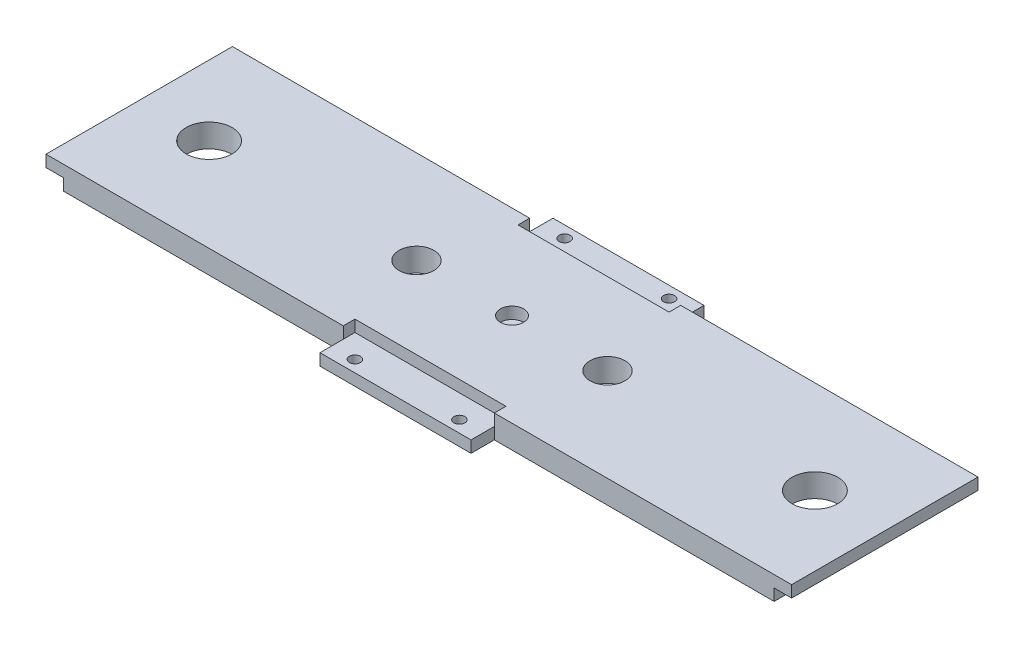
ISO-10303-21;
HEADER;
FILE_DESCRIPTION(('STEP AP214'),'2;1');
FILE_NAME('part.step','',(''),(''),'','','');
FILE_SCHEMA(('AUTOMOTIVE_DESIGN { 1 0 10303 214 1 1 1 1 }'));
ENDSEC;
DATA;
#1=APPLICATION_CONTEXT('core data for automotive mechanical design processes');
#2=APPLICATION_PROTOCOL_DEFINITION('international standard','automotive_design',2000,#1);
#3=PRODUCT_CONTEXT('',#1,'mechanical');
#4=PRODUCT('Part','Part','',(#3));
#5=PRODUCT_RELATED_PRODUCT_CATEGORY('part','',(#4));
#6=PRODUCT_DEFINITION_FORMATION('','',#4);
#7=PRODUCT_DEFINITION_CONTEXT('part definition',#1,'design');
#8=PRODUCT_DEFINITION('design','',#6,#7);
#9=PRODUCT_DEFINITION_SHAPE('','',#8);
#10=(LENGTH_UNIT() NAMED_UNIT(*) SI_UNIT(.MILLI.,.METRE.));
#11=(NAMED_UNIT(*) PLANE_ANGLE_UNIT() SI_UNIT($,.RADIAN.));
#12=(NAMED_UNIT(*) SI_UNIT($,.STERADIAN.) SOLID_ANGLE_UNIT());
#13=UNCERTAINTY_MEASURE_WITH_UNIT(LENGTH_MEASURE(1.E-05),#10,'distance_accuracy_value','');
#14=(GEOMETRIC_REPRESENTATION_CONTEXT(3) GLOBAL_UNCERTAINTY_ASSIGNED_CONTEXT((#13)) GLOBAL_UNIT_ASSIGNED_CONTEXT((#10,
#11,#12)) REPRESENTATION_CONTEXT('',''));
#15=CARTESIAN_POINT('',(0.,0.,0.));
#16=DIRECTION('',(0.,0.,1.));
#17=DIRECTION('',(1.,0.,0.));
#18=AXIS2_PLACEMENT_3D('',#15,#16,#17);
#19=CARTESIAN_POINT('',(-101.6,6.35,-25.4));
#20=DIRECTION('',(0.,0.,1.));
#21=DIRECTION('',(1.,0.,0.));
#22=AXIS2_PLACEMENT_3D('',#19,#20,#21);
#23=PLANE('',#22);
#24=DIRECTION('',(-1.,0.,0.));
#25=VECTOR('',#24,1.);
#26=CARTESIAN_POINT('',(-101.6,0.,-25.4));
#27=LINE('',#26,#25);
#28=CARTESIAN_POINT('',(96.8375,0.,-25.4));
#29=VERTEX_POINT('',#28);
#30=CARTESIAN_POINT('',(20.579999988,0.,-25.4));
#31=VERTEX_POINT('',#30);
#32=EDGE_CURVE('E56',#29,#31,#27,.T.);
#33=ORIENTED_EDGE('',*,*,#32,.T.);
#34=DIRECTION('',(0.,1.,0.));
#35=VECTOR('',#34,1.);
#36=CARTESIAN_POINT('',(20.579999988,6.35,-25.4));
#37=LINE('',#36,#35);
#38=CARTESIAN_POINT('',(20.579999988,3.175,-25.4));
#39=VERTEX_POINT('',#38);
#40=EDGE_CURVE('E198',#31,#39,#37,.T.);
#41=ORIENTED_EDGE('',*,*,#40,.T.);
#42=DIRECTION('',(0.,1.,0.));
#43=VECTOR('',#42,1.);
#44=CARTESIAN_POINT('',(20.579999988,3.175,-25.4));
#45=LINE('',#44,#43);
#46=CARTESIAN_POINT('',(20.579999988,6.35,-25.4));
#47=VERTEX_POINT('',#46);
#48=EDGE_CURVE('E403',#39,#47,#45,.T.);
#49=ORIENTED_EDGE('',*,*,#48,.T.);
#50=DIRECTION('',(-1.,0.,0.));
#51=VECTOR('',#50,1.);
#52=CARTESIAN_POINT('',(-101.6,6.35,-25.4));
#53=LINE('',#52,#51);
#54=CARTESIAN_POINT('',(101.6,6.35,-25.4));
#55=VERTEX_POINT('',#54);
#56=EDGE_CURVE('E437',#55,#47,#53,.T.);
#57=ORIENTED_EDGE('',*,*,#56,.F.);
#58=DIRECTION('',(0.,-1.,0.));
#59=VECTOR('',#58,1.);
#60=CARTESIAN_POINT('',(101.6,6.35,-25.4));
#61=LINE('',#60,#59);
#62=CARTESIAN_POINT('',(101.6,3.175,-25.4));
#63=VERTEX_POINT('',#62);
#64=EDGE_CURVE('E43',#55,#63,#61,.T.);
#65=ORIENTED_EDGE('',*,*,#64,.T.);
#66=DIRECTION('',(1.,0.,0.));
#67=VECTOR('',#66,1.);
#68=CARTESIAN_POINT('',(96.8375,3.175,-25.4));
#69=LINE('',#68,#67);
#70=CARTESIAN_POINT('',(96.8375,3.175,-25.4));
#71=VERTEX_POINT('',#70);
#72=EDGE_CURVE('E319',#71,#63,#69,.T.);
#73=ORIENTED_EDGE('',*,*,#72,.F.);
#74=DIRECTION('',(0.,-1.,0.));
#75=VECTOR('',#74,1.);
#76=CARTESIAN_POINT('',(96.8375,3.175,-25.4));
#77=LINE('',#76,#75);
#78=EDGE_CURVE('E311',#71,#29,#77,.T.);
#79=ORIENTED_EDGE('',*,*,#78,.T.);
#80=EDGE_LOOP('',(#33,#41,#49,#57,#65,#73,#79));
#81=FACE_BOUND('',#80,.T.);
#82=ADVANCED_FACE('F39',(#81),#23,.F.);
#83=CARTESIAN_POINT('',(-101.6,6.35,25.4));
#84=DIRECTION('',(0.,0.,-1.));
#85=DIRECTION('',(-1.,0.,0.));
#86=AXIS2_PLACEMENT_3D('',#83,#84,#85);
#87=PLANE('',#86);
#88=DIRECTION('',(0.,1.,0.));
#89=VECTOR('',#88,1.);
#90=CARTESIAN_POINT('',(20.579999988,3.175,25.4));
#91=LINE('',#90,#89);
#92=CARTESIAN_POINT('',(20.579999988,3.175,25.4));
#93=VERTEX_POINT('',#92);
#94=CARTESIAN_POINT('',(20.579999988,6.35,25.4));
#95=VERTEX_POINT('',#94);
#96=EDGE_CURVE('E353',#93,#95,#91,.T.);
#97=ORIENTED_EDGE('',*,*,#96,.F.);
#98=DIRECTION('',(0.,-1.,0.));
#99=VECTOR('',#98,1.);
#100=CARTESIAN_POINT('',(20.579999988,6.35,25.4));
#101=LINE('',#100,#99);
#102=CARTESIAN_POINT('',(20.579999988,0.,25.4));
#103=VERTEX_POINT('',#102);
#104=EDGE_CURVE('E271',#93,#103,#101,.T.);
#105=ORIENTED_EDGE('',*,*,#104,.T.);
#106=DIRECTION('',(1.,0.,0.));
#107=VECTOR('',#106,1.);
#108=CARTESIAN_POINT('',(-101.6,0.,25.4));
#109=LINE('',#108,#107);
#110=CARTESIAN_POINT('',(96.8375,0.,25.4));
#111=VERTEX_POINT('',#110);
#112=EDGE_CURVE('E452',#103,#111,#109,.T.);
#113=ORIENTED_EDGE('',*,*,#112,.T.);
#114=DIRECTION('',(0.,-1.,0.));
#115=VECTOR('',#114,1.);
#116=CARTESIAN_POINT('',(96.8375,3.175,25.4));
#117=LINE('',#116,#115);
#118=CARTESIAN_POINT('',(96.8375,3.175,25.4));
#119=VERTEX_POINT('',#118);
#120=EDGE_CURVE('E332',#119,#111,#117,.T.);
#121=ORIENTED_EDGE('',*,*,#120,.F.);
#122=DIRECTION('',(-1.,0.,0.));
#123=VECTOR('',#122,1.);
#124=CARTESIAN_POINT('',(101.6,3.175,25.4));
#125=LINE('',#124,#123);
#126=CARTESIAN_POINT('',(101.6,3.175,25.4));
#127=VERTEX_POINT('',#126);
#128=EDGE_CURVE('E325',#127,#119,#125,.T.);
#129=ORIENTED_EDGE('',*,*,#128,.F.);
#130=DIRECTION('',(0.,-1.,0.));
#131=VECTOR('',#130,1.);
#132=CARTESIAN_POINT('',(101.6,6.35,25.4));
#133=LINE('',#132,#131);
#134=CARTESIAN_POINT('',(101.6,6.35,25.4));
#135=VERTEX_POINT('',#134);
#136=EDGE_CURVE('E449',#135,#127,#133,.T.);
#137=ORIENTED_EDGE('',*,*,#136,.F.);
#138=DIRECTION('',(1.,0.,0.));
#139=VECTOR('',#138,1.);
#140=CARTESIAN_POINT('',(-101.6,6.35,25.4));
#141=LINE('',#140,#139);
#142=EDGE_CURVE('E444',#95,#135,#141,.T.);
#143=ORIENTED_EDGE('',*,*,#142,.F.);
#144=EDGE_LOOP('',(#97,#105,#113,#121,#129,#137,#143));
#145=FACE_BOUND('',#144,.T.);
#146=ADVANCED_FACE('F483',(#145),#87,.F.);
#147=CARTESIAN_POINT('',(101.6,6.35,25.4));
#148=DIRECTION('',(-1.,0.,0.));
#149=DIRECTION('',(0.,0.,1.));
#150=AXIS2_PLACEMENT_3D('',#147,#148,#149);
#151=PLANE('',#150);
#152=DIRECTION('',(0.,0.,1.));
#153=VECTOR('',#152,1.);
#154=CARTESIAN_POINT('',(101.6,3.175,-25.4));
#155=LINE('',#154,#153);
#156=EDGE_CURVE('E322',#63,#127,#155,.T.);
#157=ORIENTED_EDGE('',*,*,#156,.F.);
#158=ORIENTED_EDGE('',*,*,#64,.F.);
#159=DIRECTION('',(0.,0.,-1.));
#160=VECTOR('',#159,1.);
#161=CARTESIAN_POINT('',(101.6,6.35,25.4));
#162=LINE('',#161,#160);
#163=EDGE_CURVE('E432',#135,#55,#162,.T.);
#164=ORIENTED_EDGE('',*,*,#163,.F.);
#165=ORIENTED_EDGE('',*,*,#136,.T.);
#166=EDGE_LOOP('',(#157,#158,#164,#165));
#167=FACE_BOUND('',#166,.T.);
#168=ADVANCED_FACE('F41',(#167),#151,.F.);
#169=CARTESIAN_POINT('',(0.,6.35,0.));
#170=DIRECTION('',(0.,-1.,0.));
#171=DIRECTION('',(0.,0.,-1.));
#172=AXIS2_PLACEMENT_3D('',#169,#170,#171);
#173=PLANE('',#172);
#174=CARTESIAN_POINT('',(-26.035,6.35,0.));
#175=DIRECTION('',(0.,1.,0.));
#176=DIRECTION('',(0.,0.,1.));
#177=AXIS2_PLACEMENT_3D('',#174,#175,#176);
#178=CIRCLE('',#177,4.7625);
#179=CARTESIAN_POINT('',(-26.035,6.35,4.7625));
#180=VERTEX_POINT('',#179);
#181=EDGE_CURVE('E283',#180,#180,#178,.T.);
#182=ORIENTED_EDGE('',*,*,#181,.F.);
#183=EDGE_LOOP('',(#182));
#184=FACE_BOUND('',#183,.T.);
#185=CARTESIAN_POINT('',(26.035,6.35,0.));
#186=DIRECTION('',(0.,1.,0.));
#187=DIRECTION('',(0.,0.,-1.));
#188=AXIS2_PLACEMENT_3D('',#185,#186,#187);
#189=CIRCLE('',#188,4.7625);
#190=CARTESIAN_POINT('',(26.035,6.35,-4.76250000000001));
#191=VERTEX_POINT('',#190);
#192=EDGE_CURVE('E276',#191,#191,#189,.T.);
#193=ORIENTED_EDGE('',*,*,#192,.F.);
#194=EDGE_LOOP('',(#193));
#195=FACE_BOUND('',#194,.T.);
#196=CARTESIAN_POINT('',(-101.6,6.35,25.4));
#197=VERTEX_POINT('',#196);
#198=CARTESIAN_POINT('',(-20.579999988,6.35,25.4));
#199=VERTEX_POINT('',#198);
#200=EDGE_CURVE('E445',#197,#199,#141,.T.);
#201=ORIENTED_EDGE('',*,*,#200,.T.);
#202=DIRECTION('',(0.,0.,1.));
#203=VECTOR('',#202,1.);
#204=CARTESIAN_POINT('',(-20.579999988,6.35,22.225));
#205=LINE('',#204,#203);
#206=CARTESIAN_POINT('',(-20.579999988,6.35,22.225));
#207=VERTEX_POINT('',#206);
#208=EDGE_CURVE('E345',#207,#199,#205,.T.);
#209=ORIENTED_EDGE('',*,*,#208,.F.);
#210=DIRECTION('',(-1.,0.,0.));
#211=VECTOR('',#210,1.);
#212=CARTESIAN_POINT('',(20.579999988,6.35,22.225));
#213=LINE('',#212,#211);
#214=CARTESIAN_POINT('',(20.579999988,6.35,22.225));
#215=VERTEX_POINT('',#214);
#216=EDGE_CURVE('E358',#215,#207,#213,.T.);
#217=ORIENTED_EDGE('',*,*,#216,.F.);
#218=DIRECTION('',(0.,0.,-1.));
#219=VECTOR('',#218,1.);
#220=CARTESIAN_POINT('',(20.579999988,6.35,25.4));
#221=LINE('',#220,#219);
#222=EDGE_CURVE('E354',#95,#215,#221,.T.);
#223=ORIENTED_EDGE('',*,*,#222,.F.);
#224=ORIENTED_EDGE('',*,*,#142,.T.);
#225=ORIENTED_EDGE('',*,*,#163,.T.);
#226=ORIENTED_EDGE('',*,*,#56,.T.);
#227=DIRECTION('',(0.,0.,-1.));
#228=VECTOR('',#227,1.);
#229=CARTESIAN_POINT('',(20.579999988,6.35,-25.4));
#230=LINE('',#229,#228);
#231=CARTESIAN_POINT('',(20.579999988,6.35,-22.225));
#232=VERTEX_POINT('',#231);
#233=EDGE_CURVE('E383',#232,#47,#230,.T.);
#234=ORIENTED_EDGE('',*,*,#233,.F.);
#235=DIRECTION('',(1.,0.,0.));
#236=VECTOR('',#235,1.);
#237=CARTESIAN_POINT('',(20.579999988,6.35,-22.225));
#238=LINE('',#237,#236);
#239=CARTESIAN_POINT('',(-20.579999988,6.35,-22.225));
#240=VERTEX_POINT('',#239);
#241=EDGE_CURVE('E395',#240,#232,#238,.T.);
#242=ORIENTED_EDGE('',*,*,#241,.F.);
#243=DIRECTION('',(0.,0.,1.));
#244=VECTOR('',#243,1.);
#245=CARTESIAN_POINT('',(-20.579999988,6.35,-22.225));
#246=LINE('',#245,#244);
#247=CARTESIAN_POINT('',(-20.579999988,6.35,-25.4));
#248=VERTEX_POINT('',#247);
#249=EDGE_CURVE('E315',#248,#240,#246,.T.);
#250=ORIENTED_EDGE('',*,*,#249,.F.);
#251=CARTESIAN_POINT('',(-101.6,6.35,-25.4));
#252=VERTEX_POINT('',#251);
#253=EDGE_CURVE('E436',#248,#252,#53,.T.);
#254=ORIENTED_EDGE('',*,*,#253,.T.);
#255=DIRECTION('',(0.,0.,1.));
#256=VECTOR('',#255,1.);
#257=CARTESIAN_POINT('',(-101.6,6.35,25.4));
#258=LINE('',#257,#256);
#259=EDGE_CURVE('E441',#252,#197,#258,.T.);
#260=ORIENTED_EDGE('',*,*,#259,.T.);
#261=EDGE_LOOP('',(#201,#209,#217,#223,#224,#225,#226,#234,#242,#250,#254,#260));
#262=FACE_BOUND('',#261,.T.);
#263=CARTESIAN_POINT('',(-82.55,6.35,0.));
#264=DIRECTION('',(0.,1.,0.));
#265=DIRECTION('',(0.,0.,1.));
#266=AXIS2_PLACEMENT_3D('',#263,#264,#265);
#267=CIRCLE('',#266,6.25);
#268=CARTESIAN_POINT('',(-82.55,6.35,6.25));
#269=VERTEX_POINT('',#268);
#270=EDGE_CURVE('E424',#269,#269,#267,.T.);
#271=ORIENTED_EDGE('',*,*,#270,.F.);
#272=EDGE_LOOP('',(#271));
#273=FACE_BOUND('',#272,.T.);
#274=CARTESIAN_POINT('',(82.55,6.35,0.));
#275=DIRECTION('',(0.,1.,0.));
#276=DIRECTION('',(0.,0.,-1.));
#277=AXIS2_PLACEMENT_3D('',#274,#275,#276);
#278=CIRCLE('',#277,6.25);
#279=CARTESIAN_POINT('',(82.55,6.35,-6.25));
#280=VERTEX_POINT('',#279);
#281=EDGE_CURVE('E416',#280,#280,#278,.T.);
#282=ORIENTED_EDGE('',*,*,#281,.F.);
#283=EDGE_LOOP('',(#282));
#284=FACE_BOUND('',#283,.T.);
#285=CARTESIAN_POINT('',(0.,6.35,0.));
#286=DIRECTION('',(0.,1.,0.));
#287=DIRECTION('',(0.,0.,1.));
#288=AXIS2_PLACEMENT_3D('',#285,#286,#287);
#289=CIRCLE('',#288,3.175);
#290=CARTESIAN_POINT('',(0.,6.35,3.175));
#291=VERTEX_POINT('',#290);
#292=EDGE_CURVE('E369',#291,#291,#289,.T.);
#293=ORIENTED_EDGE('',*,*,#292,.F.);
#294=EDGE_LOOP('',(#293));
#295=FACE_BOUND('',#294,.T.);
#296=ADVANCED_FACE('F519',(#184,#195,#262,#273,#284,#295),#173,.F.);
#297=CARTESIAN_POINT('',(0.,0.,0.));
#298=DIRECTION('',(0.,-1.,0.));
#299=DIRECTION('',(0.,0.,-1.));
#300=AXIS2_PLACEMENT_3D('',#297,#298,#299);
#301=PLANE('',#300);
#302=CARTESIAN_POINT('',(-14.229999988,0.,28.575));
#303=DIRECTION('',(0.,-1.,0.));
#304=DIRECTION('',(0.,0.,-1.));
#305=AXIS2_PLACEMENT_3D('',#302,#303,#304);
#306=CIRCLE('',#305,1.5);
#307=CARTESIAN_POINT('',(-14.229999988,0.,27.075));
#308=VERTEX_POINT('',#307);
#309=EDGE_CURVE('E221',#308,#308,#306,.T.);
#310=ORIENTED_EDGE('',*,*,#309,.F.);
#311=EDGE_LOOP('',(#310));
#312=FACE_BOUND('',#311,.T.);
#313=CARTESIAN_POINT('',(14.229999988,0.,28.575));
#314=DIRECTION('',(0.,-1.,0.));
#315=DIRECTION('',(0.,0.,-1.));
#316=AXIS2_PLACEMENT_3D('',#313,#314,#315);
#317=CIRCLE('',#316,1.5);
#318=CARTESIAN_POINT('',(14.229999988,0.,27.075));
#319=VERTEX_POINT('',#318);
#320=EDGE_CURVE('E225',#319,#319,#317,.T.);
#321=ORIENTED_EDGE('',*,*,#320,.F.);
#322=EDGE_LOOP('',(#321));
#323=FACE_BOUND('',#322,.T.);
#324=CARTESIAN_POINT('',(14.229999988,0.,-28.575));
#325=DIRECTION('',(0.,-1.,0.));
#326=DIRECTION('',(0.,0.,-1.));
#327=AXIS2_PLACEMENT_3D('',#324,#325,#326);
#328=CIRCLE('',#327,1.5);
#329=CARTESIAN_POINT('',(14.229999988,0.,-30.075));
#330=VERTEX_POINT('',#329);
#331=EDGE_CURVE('E631',#330,#330,#328,.T.);
#332=ORIENTED_EDGE('',*,*,#331,.F.);
#333=EDGE_LOOP('',(#332));
#334=FACE_BOUND('',#333,.T.);
#335=CARTESIAN_POINT('',(-14.229999988,0.,-28.575));
#336=DIRECTION('',(0.,-1.,0.));
#337=DIRECTION('',(0.,0.,-1.));
#338=AXIS2_PLACEMENT_3D('',#335,#336,#337);
#339=CIRCLE('',#338,1.5);
#340=CARTESIAN_POINT('',(-14.229999988,0.,-30.075));
#341=VERTEX_POINT('',#340);
#342=EDGE_CURVE('E626',#341,#341,#339,.T.);
#343=ORIENTED_EDGE('',*,*,#342,.F.);
#344=EDGE_LOOP('',(#343));
#345=FACE_BOUND('',#344,.T.);
#346=CARTESIAN_POINT('',(-20.579999988,0.,-25.4));
#347=VERTEX_POINT('',#346);
#348=CARTESIAN_POINT('',(-96.8375,0.,-25.4));
#349=VERTEX_POINT('',#348);
#350=EDGE_CURVE('E428',#347,#349,#27,.T.);
#351=ORIENTED_EDGE('',*,*,#350,.F.);
#352=DIRECTION('',(0.,0.,-1.));
#353=VECTOR('',#352,1.);
#354=CARTESIAN_POINT('',(-20.579999988,0.,31.75));
#355=LINE('',#354,#353);
#356=CARTESIAN_POINT('',(-20.579999988,0.,-31.75));
#357=VERTEX_POINT('',#356);
#358=EDGE_CURVE('E209',#347,#357,#355,.T.);
#359=ORIENTED_EDGE('',*,*,#358,.T.);
#360=DIRECTION('',(-1.,0.,0.));
#361=VECTOR('',#360,1.);
#362=CARTESIAN_POINT('',(20.579999988,0.,-31.75));
#363=LINE('',#362,#361);
#364=CARTESIAN_POINT('',(20.579999988,0.,-31.75));
#365=VERTEX_POINT('',#364);
#366=EDGE_CURVE('E205',#365,#357,#363,.T.);
#367=ORIENTED_EDGE('',*,*,#366,.F.);
#368=DIRECTION('',(0.,0.,-1.));
#369=VECTOR('',#368,1.);
#370=CARTESIAN_POINT('',(20.579999988,0.,31.75));
#371=LINE('',#370,#369);
#372=EDGE_CURVE('E192',#31,#365,#371,.T.);
#373=ORIENTED_EDGE('',*,*,#372,.F.);
#374=ORIENTED_EDGE('',*,*,#32,.F.);
#375=DIRECTION('',(0.,0.,-1.));
#376=VECTOR('',#375,1.);
#377=CARTESIAN_POINT('',(96.8375,0.,25.4));
#378=LINE('',#377,#376);
#379=EDGE_CURVE('E282',#111,#29,#378,.T.);
#380=ORIENTED_EDGE('',*,*,#379,.F.);
#381=ORIENTED_EDGE('',*,*,#112,.F.);
#382=CARTESIAN_POINT('',(20.579999988,0.,31.75));
#383=VERTEX_POINT('',#382);
#384=EDGE_CURVE('E201',#383,#103,#371,.T.);
#385=ORIENTED_EDGE('',*,*,#384,.F.);
#386=DIRECTION('',(-1.,0.,0.));
#387=VECTOR('',#386,1.);
#388=CARTESIAN_POINT('',(20.579999988,0.,31.75));
#389=LINE('',#388,#387);
#390=CARTESIAN_POINT('',(-20.579999988,0.,31.75));
#391=VERTEX_POINT('',#390);
#392=EDGE_CURVE('E237',#383,#391,#389,.T.);
#393=ORIENTED_EDGE('',*,*,#392,.T.);
#394=CARTESIAN_POINT('',(-20.579999988,0.,25.4));
#395=VERTEX_POINT('',#394);
#396=EDGE_CURVE('E259',#391,#395,#355,.T.);
#397=ORIENTED_EDGE('',*,*,#396,.T.);
#398=CARTESIAN_POINT('',(-96.8375,0.,25.4));
#399=VERTEX_POINT('',#398);
#400=EDGE_CURVE('E64',#399,#395,#109,.T.);
#401=ORIENTED_EDGE('',*,*,#400,.F.);
#402=DIRECTION('',(0.,0.,1.));
#403=VECTOR('',#402,1.);
#404=CARTESIAN_POINT('',(-96.8375,0.,25.4));
#405=LINE('',#404,#403);
#406=EDGE_CURVE('E298',#349,#399,#405,.T.);
#407=ORIENTED_EDGE('',*,*,#406,.F.);
#408=EDGE_LOOP('',(#351,#359,#367,#373,#374,#380,#381,#385,#393,#397,#401,#407));
#409=FACE_BOUND('',#408,.T.);
#410=CARTESIAN_POINT('',(-26.035,0.,0.));
#411=DIRECTION('',(0.,1.,0.));
#412=DIRECTION('',(0.,0.,1.));
#413=AXIS2_PLACEMENT_3D('',#410,#411,#412);
#414=CIRCLE('',#413,4.7625);
#415=CARTESIAN_POINT('',(-26.035,0.,4.7625));
#416=VERTEX_POINT('',#415);
#417=EDGE_CURVE('E278',#416,#416,#414,.T.);
#418=ORIENTED_EDGE('',*,*,#417,.T.);
#419=EDGE_LOOP('',(#418));
#420=FACE_BOUND('',#419,.T.);
#421=CARTESIAN_POINT('',(-82.55,0.,0.));
#422=DIRECTION('',(0.,1.,0.));
#423=DIRECTION('',(0.,0.,1.));
#424=AXIS2_PLACEMENT_3D('',#421,#422,#423);
#425=CIRCLE('',#424,6.25);
#426=CARTESIAN_POINT('',(-82.55,0.,6.25));
#427=VERTEX_POINT('',#426);
#428=EDGE_CURVE('E420',#427,#427,#425,.T.);
#429=ORIENTED_EDGE('',*,*,#428,.T.);
#430=EDGE_LOOP('',(#429));
#431=FACE_BOUND('',#430,.T.);
#432=CARTESIAN_POINT('',(82.55,0.,0.));
#433=DIRECTION('',(0.,1.,0.));
#434=DIRECTION('',(0.,0.,-1.));
#435=AXIS2_PLACEMENT_3D('',#432,#433,#434);
#436=CIRCLE('',#435,6.25);
#437=CARTESIAN_POINT('',(82.55,0.,-6.25));
#438=VERTEX_POINT('',#437);
#439=EDGE_CURVE('E415',#438,#438,#436,.T.);
#440=ORIENTED_EDGE('',*,*,#439,.T.);
#441=EDGE_LOOP('',(#440));
#442=FACE_BOUND('',#441,.T.);
#443=CARTESIAN_POINT('',(26.035,0.,0.));
#444=DIRECTION('',(0.,1.,0.));
#445=DIRECTION('',(0.,0.,-1.));
#446=AXIS2_PLACEMENT_3D('',#443,#444,#445);
#447=CIRCLE('',#446,4.7625);
#448=CARTESIAN_POINT('',(26.035,0.,-4.76250000000001));
#449=VERTEX_POINT('',#448);
#450=EDGE_CURVE('E287',#449,#449,#447,.T.);
#451=ORIENTED_EDGE('',*,*,#450,.T.);
#452=EDGE_LOOP('',(#451));
#453=FACE_BOUND('',#452,.T.);
#454=ADVANCED_FACE('F206',(#312,#323,#334,#345,#409,#420,#431,#442,#453),#301,.T.);
#455=DIRECTION('',(0.,1.,0.));
#456=VECTOR('',#455,1.);
#457=CARTESIAN_POINT('',(-20.579999988,3.175,-25.4));
#458=LINE('',#457,#456);
#459=CARTESIAN_POINT('',(-20.579999988,3.175,-25.4));
#460=VERTEX_POINT('',#459);
#461=EDGE_CURVE('E359',#460,#248,#458,.T.);
#462=ORIENTED_EDGE('',*,*,#461,.F.);
#463=DIRECTION('',(0.,-1.,0.));
#464=VECTOR('',#463,1.);
#465=CARTESIAN_POINT('',(-20.579999988,6.35000000000009,-25.4));
#466=LINE('',#465,#464);
#467=EDGE_CURVE('E267',#460,#347,#466,.T.);
#468=ORIENTED_EDGE('',*,*,#467,.T.);
#469=ORIENTED_EDGE('',*,*,#350,.T.);
#470=DIRECTION('',(0.,-1.,0.));
#471=VECTOR('',#470,1.);
#472=CARTESIAN_POINT('',(-96.8375,3.175,-25.4));
#473=LINE('',#472,#471);
#474=CARTESIAN_POINT('',(-96.8375,3.175,-25.4));
#475=VERTEX_POINT('',#474);
#476=EDGE_CURVE('E308',#475,#349,#473,.T.);
#477=ORIENTED_EDGE('',*,*,#476,.F.);
#478=DIRECTION('',(1.,0.,0.));
#479=VECTOR('',#478,1.);
#480=CARTESIAN_POINT('',(-96.8375,3.175,-25.4));
#481=LINE('',#480,#479);
#482=CARTESIAN_POINT('',(-101.6,3.175,-25.4));
#483=VERTEX_POINT('',#482);
#484=EDGE_CURVE('E297',#483,#475,#481,.T.);
#485=ORIENTED_EDGE('',*,*,#484,.F.);
#486=DIRECTION('',(0.,-1.,0.));
#487=VECTOR('',#486,1.);
#488=CARTESIAN_POINT('',(-101.6,6.35,-25.4));
#489=LINE('',#488,#487);
#490=EDGE_CURVE('E461',#252,#483,#489,.T.);
#491=ORIENTED_EDGE('',*,*,#490,.F.);
#492=ORIENTED_EDGE('',*,*,#253,.F.);
#493=EDGE_LOOP('',(#462,#468,#469,#477,#485,#491,#492));
#494=FACE_BOUND('',#493,.T.);
#495=ADVANCED_FACE('F528',(#494),#23,.F.);
#496=CARTESIAN_POINT('',(-101.6,6.35,25.4));
#497=DIRECTION('',(1.,0.,0.));
#498=DIRECTION('',(0.,0.,-1.));
#499=AXIS2_PLACEMENT_3D('',#496,#497,#498);
#500=PLANE('',#499);
#501=ORIENTED_EDGE('',*,*,#490,.T.);
#502=DIRECTION('',(0.,0.,-1.));
#503=VECTOR('',#502,1.);
#504=CARTESIAN_POINT('',(-101.6,3.175,-25.4));
#505=LINE('',#504,#503);
#506=CARTESIAN_POINT('',(-101.6,3.175,25.4));
#507=VERTEX_POINT('',#506);
#508=EDGE_CURVE('E294',#507,#483,#505,.T.);
#509=ORIENTED_EDGE('',*,*,#508,.F.);
#510=DIRECTION('',(0.,-1.,0.));
#511=VECTOR('',#510,1.);
#512=CARTESIAN_POINT('',(-101.6,6.35,25.4));
#513=LINE('',#512,#511);
#514=EDGE_CURVE('E458',#197,#507,#513,.T.);
#515=ORIENTED_EDGE('',*,*,#514,.F.);
#516=ORIENTED_EDGE('',*,*,#259,.F.);
#517=EDGE_LOOP('',(#501,#509,#515,#516));
#518=FACE_BOUND('',#517,.T.);
#519=ADVANCED_FACE('F516',(#518),#500,.F.);
#520=ORIENTED_EDGE('',*,*,#400,.T.);
#521=DIRECTION('',(0.,1.,0.));
#522=VECTOR('',#521,1.);
#523=CARTESIAN_POINT('',(-20.579999988,6.35000000000009,25.4));
#524=LINE('',#523,#522);
#525=CARTESIAN_POINT('',(-20.579999988,3.175,25.4));
#526=VERTEX_POINT('',#525);
#527=EDGE_CURVE('E252',#395,#526,#524,.T.);
#528=ORIENTED_EDGE('',*,*,#527,.T.);
#529=DIRECTION('',(0.,1.,0.));
#530=VECTOR('',#529,1.);
#531=CARTESIAN_POINT('',(-20.579999988,3.175,25.4));
#532=LINE('',#531,#530);
#533=EDGE_CURVE('E365',#526,#199,#532,.T.);
#534=ORIENTED_EDGE('',*,*,#533,.T.);
#535=ORIENTED_EDGE('',*,*,#200,.F.);
#536=ORIENTED_EDGE('',*,*,#514,.T.);
#537=DIRECTION('',(-1.,0.,0.));
#538=VECTOR('',#537,1.);
#539=CARTESIAN_POINT('',(-101.6,3.175,25.4));
#540=LINE('',#539,#538);
#541=CARTESIAN_POINT('',(-96.8375,3.175,25.4));
#542=VERTEX_POINT('',#541);
#543=EDGE_CURVE('E305',#542,#507,#540,.T.);
#544=ORIENTED_EDGE('',*,*,#543,.F.);
#545=DIRECTION('',(0.,-1.,0.));
#546=VECTOR('',#545,1.);
#547=CARTESIAN_POINT('',(-96.8375,3.175,25.4));
#548=LINE('',#547,#546);
#549=EDGE_CURVE('E312',#542,#399,#548,.T.);
#550=ORIENTED_EDGE('',*,*,#549,.T.);
#551=EDGE_LOOP('',(#520,#528,#534,#535,#536,#544,#550));
#552=FACE_BOUND('',#551,.T.);
#553=ADVANCED_FACE('F510',(#552),#87,.F.);
#554=CARTESIAN_POINT('',(-82.55,6.35,0.));
#555=DIRECTION('',(0.,-1.,0.));
#556=DIRECTION('',(0.,0.,-1.));
#557=AXIS2_PLACEMENT_3D('',#554,#555,#556);
#558=CYLINDRICAL_SURFACE('',#557,6.25);
#559=ORIENTED_EDGE('',*,*,#270,.T.);
#560=EDGE_LOOP('',(#559));
#561=FACE_BOUND('',#560,.T.);
#562=ORIENTED_EDGE('',*,*,#428,.F.);
#563=EDGE_LOOP('',(#562));
#564=FACE_BOUND('',#563,.T.);
#565=ADVANCED_FACE('F585',(#561,#564),#558,.F.);
#566=CARTESIAN_POINT('',(82.55,6.35,0.));
#567=DIRECTION('',(0.,-1.,0.));
#568=DIRECTION('',(0.,0.,-1.));
#569=AXIS2_PLACEMENT_3D('',#566,#567,#568);
#570=CYLINDRICAL_SURFACE('',#569,6.25);
#571=ORIENTED_EDGE('',*,*,#281,.T.);
#572=EDGE_LOOP('',(#571));
#573=FACE_BOUND('',#572,.T.);
#574=ORIENTED_EDGE('',*,*,#439,.F.);
#575=EDGE_LOOP('',(#574));
#576=FACE_BOUND('',#575,.T.);
#577=ADVANCED_FACE('F589',(#573,#576),#570,.F.);
#578=CARTESIAN_POINT('',(0.,6.35,0.));
#579=DIRECTION('',(0.,-1.,0.));
#580=DIRECTION('',(0.,0.,-1.));
#581=AXIS2_PLACEMENT_3D('',#578,#579,#580);
#582=CYLINDRICAL_SURFACE('',#581,3.175);
#583=CARTESIAN_POINT('',(0.,3.175,0.));
#584=DIRECTION('',(0.,1.,0.));
#585=DIRECTION('',(0.,0.,1.));
#586=AXIS2_PLACEMENT_3D('',#583,#584,#585);
#587=CIRCLE('',#586,3.175);
#588=CARTESIAN_POINT('',(0.,3.175,3.175));
#589=VERTEX_POINT('',#588);
#590=EDGE_CURVE('E11',#589,#589,#587,.T.);
#591=ORIENTED_EDGE('',*,*,#590,.F.);
#592=EDGE_LOOP('',(#591));
#593=FACE_BOUND('',#592,.T.);
#594=ORIENTED_EDGE('',*,*,#292,.T.);
#595=EDGE_LOOP('',(#594));
#596=FACE_BOUND('',#595,.T.);
#597=ADVANCED_FACE('F561',(#593,#596),#582,.F.);
#598=CARTESIAN_POINT('',(-20.579999988,3.175,22.225));
#599=DIRECTION('',(-1.,0.,0.));
#600=DIRECTION('',(0.,0.,1.));
#601=AXIS2_PLACEMENT_3D('',#598,#599,#600);
#602=PLANE('',#601);
#603=ORIENTED_EDGE('',*,*,#208,.T.);
#604=ORIENTED_EDGE('',*,*,#533,.F.);
#605=DIRECTION('',(0.,0.,1.));
#606=VECTOR('',#605,1.);
#607=CARTESIAN_POINT('',(-20.579999988,3.175,22.225));
#608=LINE('',#607,#606);
#609=CARTESIAN_POINT('',(-20.579999988,3.175,22.225));
#610=VERTEX_POINT('',#609);
#611=EDGE_CURVE('E349',#610,#526,#608,.T.);
#612=ORIENTED_EDGE('',*,*,#611,.F.);
#613=DIRECTION('',(0.,1.,0.));
#614=VECTOR('',#613,1.);
#615=CARTESIAN_POINT('',(-20.579999988,3.175,22.225));
#616=LINE('',#615,#614);
#617=EDGE_CURVE('E370',#610,#207,#616,.T.);
#618=ORIENTED_EDGE('',*,*,#617,.T.);
#619=EDGE_LOOP('',(#603,#604,#612,#618));
#620=FACE_BOUND('',#619,.T.);
#621=ADVANCED_FACE('F552',(#620),#602,.F.);
#622=CARTESIAN_POINT('',(20.579999988,3.175,22.225));
#623=DIRECTION('',(0.,0.,-1.));
#624=DIRECTION('',(-1.,0.,0.));
#625=AXIS2_PLACEMENT_3D('',#622,#623,#624);
#626=PLANE('',#625);
#627=ORIENTED_EDGE('',*,*,#216,.T.);
#628=ORIENTED_EDGE('',*,*,#617,.F.);
#629=DIRECTION('',(-1.,0.,0.));
#630=VECTOR('',#629,1.);
#631=CARTESIAN_POINT('',(20.579999988,3.175,22.225));
#632=LINE('',#631,#630);
#633=CARTESIAN_POINT('',(20.579999988,3.175,22.225));
#634=VERTEX_POINT('',#633);
#635=EDGE_CURVE('E344',#634,#610,#632,.T.);
#636=ORIENTED_EDGE('',*,*,#635,.F.);
#637=DIRECTION('',(0.,1.,0.));
#638=VECTOR('',#637,1.);
#639=CARTESIAN_POINT('',(20.579999988,3.175,22.225));
#640=LINE('',#639,#638);
#641=EDGE_CURVE('E373',#634,#215,#640,.T.);
#642=ORIENTED_EDGE('',*,*,#641,.T.);
#643=EDGE_LOOP('',(#627,#628,#636,#642));
#644=FACE_BOUND('',#643,.T.);
#645=ADVANCED_FACE('F553',(#644),#626,.F.);
#646=CARTESIAN_POINT('',(20.579999988,3.175,25.4));
#647=DIRECTION('',(1.,0.,0.));
#648=DIRECTION('',(0.,0.,-1.));
#649=AXIS2_PLACEMENT_3D('',#646,#647,#648);
#650=PLANE('',#649);
#651=ORIENTED_EDGE('',*,*,#222,.T.);
#652=ORIENTED_EDGE('',*,*,#641,.F.);
#653=DIRECTION('',(0.,0.,-1.));
#654=VECTOR('',#653,1.);
#655=CARTESIAN_POINT('',(20.579999988,3.175,25.4));
#656=LINE('',#655,#654);
#657=EDGE_CURVE('E340',#93,#634,#656,.T.);
#658=ORIENTED_EDGE('',*,*,#657,.F.);
#659=ORIENTED_EDGE('',*,*,#96,.T.);
#660=EDGE_LOOP('',(#651,#652,#658,#659));
#661=FACE_BOUND('',#660,.T.);
#662=ADVANCED_FACE('F548',(#661),#650,.F.);
#663=CARTESIAN_POINT('',(0.,3.175,0.));
#664=DIRECTION('',(0.,1.,0.));
#665=DIRECTION('',(0.,0.,1.));
#666=AXIS2_PLACEMENT_3D('',#663,#664,#665);
#667=PLANE('',#666);
#668=CARTESIAN_POINT('',(-14.229999988,3.175,28.575));
#669=DIRECTION('',(0.,1.,0.));
#670=DIRECTION('',(0.,0.,-1.));
#671=AXIS2_PLACEMENT_3D('',#668,#669,#670);
#672=CIRCLE('',#671,1.5);
#673=CARTESIAN_POINT('',(-14.229999988,3.175,27.075));
#674=VERTEX_POINT('',#673);
#675=EDGE_CURVE('E636',#674,#674,#672,.T.);
#676=ORIENTED_EDGE('',*,*,#675,.F.);
#677=EDGE_LOOP('',(#676));
#678=FACE_BOUND('',#677,.T.);
#679=CARTESIAN_POINT('',(14.229999988,3.175,28.575));
#680=DIRECTION('',(0.,1.,0.));
#681=DIRECTION('',(0.,0.,1.));
#682=AXIS2_PLACEMENT_3D('',#679,#680,#681);
#683=CIRCLE('',#682,1.5);
#684=CARTESIAN_POINT('',(14.229999988,3.175,30.075));
#685=VERTEX_POINT('',#684);
#686=EDGE_CURVE('E633',#685,#685,#683,.T.);
#687=ORIENTED_EDGE('',*,*,#686,.F.);
#688=EDGE_LOOP('',(#687));
#689=FACE_BOUND('',#688,.T.);
#690=ORIENTED_EDGE('',*,*,#611,.T.);
#691=DIRECTION('',(0.,0.,-1.));
#692=VECTOR('',#691,1.);
#693=CARTESIAN_POINT('',(-20.579999988,3.175,31.75));
#694=LINE('',#693,#692);
#695=CARTESIAN_POINT('',(-20.579999988,3.175,31.75));
#696=VERTEX_POINT('',#695);
#697=EDGE_CURVE('E254',#696,#526,#694,.T.);
#698=ORIENTED_EDGE('',*,*,#697,.F.);
#699=DIRECTION('',(1.,0.,0.));
#700=VECTOR('',#699,1.);
#701=CARTESIAN_POINT('',(20.579999988,3.175,31.75));
#702=LINE('',#701,#700);
#703=CARTESIAN_POINT('',(20.579999988,3.175,31.75));
#704=VERTEX_POINT('',#703);
#705=EDGE_CURVE('E202',#696,#704,#702,.T.);
#706=ORIENTED_EDGE('',*,*,#705,.T.);
#707=DIRECTION('',(0.,0.,-1.));
#708=VECTOR('',#707,1.);
#709=CARTESIAN_POINT('',(20.579999988,3.175,31.75));
#710=LINE('',#709,#708);
#711=EDGE_CURVE('E248',#704,#93,#710,.T.);
#712=ORIENTED_EDGE('',*,*,#711,.T.);
#713=ORIENTED_EDGE('',*,*,#657,.T.);
#714=ORIENTED_EDGE('',*,*,#635,.T.);
#715=EDGE_LOOP('',(#690,#698,#706,#712,#713,#714));
#716=FACE_BOUND('',#715,.T.);
#717=ADVANCED_FACE('F499',(#678,#689,#716),#667,.T.);
#718=CARTESIAN_POINT('',(-20.579999988,3.175,-22.225));
#719=DIRECTION('',(-1.,0.,0.));
#720=DIRECTION('',(0.,0.,1.));
#721=AXIS2_PLACEMENT_3D('',#718,#719,#720);
#722=PLANE('',#721);
#723=ORIENTED_EDGE('',*,*,#249,.T.);
#724=DIRECTION('',(0.,1.,0.));
#725=VECTOR('',#724,1.);
#726=CARTESIAN_POINT('',(-20.579999988,3.175,-22.225));
#727=LINE('',#726,#725);
#728=CARTESIAN_POINT('',(-20.579999988,3.175,-22.225));
#729=VERTEX_POINT('',#728);
#730=EDGE_CURVE('E391',#729,#240,#727,.T.);
#731=ORIENTED_EDGE('',*,*,#730,.F.);
#732=DIRECTION('',(0.,0.,1.));
#733=VECTOR('',#732,1.);
#734=CARTESIAN_POINT('',(-20.579999988,3.175,-22.225));
#735=LINE('',#734,#733);
#736=EDGE_CURVE('E378',#460,#729,#735,.T.);
#737=ORIENTED_EDGE('',*,*,#736,.F.);
#738=ORIENTED_EDGE('',*,*,#461,.T.);
#739=EDGE_LOOP('',(#723,#731,#737,#738));
#740=FACE_BOUND('',#739,.T.);
#741=ADVANCED_FACE('F601',(#740),#722,.F.);
#742=CARTESIAN_POINT('',(20.579999988,3.175,-25.4));
#743=DIRECTION('',(1.,0.,0.));
#744=DIRECTION('',(0.,0.,-1.));
#745=AXIS2_PLACEMENT_3D('',#742,#743,#744);
#746=PLANE('',#745);
#747=ORIENTED_EDGE('',*,*,#233,.T.);
#748=ORIENTED_EDGE('',*,*,#48,.F.);
#749=DIRECTION('',(0.,0.,-1.));
#750=VECTOR('',#749,1.);
#751=CARTESIAN_POINT('',(20.579999988,3.175,-25.4));
#752=LINE('',#751,#750);
#753=CARTESIAN_POINT('',(20.579999988,3.175,-22.225));
#754=VERTEX_POINT('',#753);
#755=EDGE_CURVE('E387',#754,#39,#752,.T.);
#756=ORIENTED_EDGE('',*,*,#755,.F.);
#757=DIRECTION('',(0.,1.,0.));
#758=VECTOR('',#757,1.);
#759=CARTESIAN_POINT('',(20.579999988,3.175,-22.225));
#760=LINE('',#759,#758);
#761=EDGE_CURVE('E407',#754,#232,#760,.T.);
#762=ORIENTED_EDGE('',*,*,#761,.T.);
#763=EDGE_LOOP('',(#747,#748,#756,#762));
#764=FACE_BOUND('',#763,.T.);
#765=ADVANCED_FACE('F543',(#764),#746,.F.);
#766=CARTESIAN_POINT('',(20.579999988,3.175,-22.225));
#767=DIRECTION('',(0.,0.,1.));
#768=DIRECTION('',(1.,0.,0.));
#769=AXIS2_PLACEMENT_3D('',#766,#767,#768);
#770=PLANE('',#769);
#771=ORIENTED_EDGE('',*,*,#241,.T.);
#772=ORIENTED_EDGE('',*,*,#761,.F.);
#773=DIRECTION('',(1.,0.,0.));
#774=VECTOR('',#773,1.);
#775=CARTESIAN_POINT('',(20.579999988,3.175,-22.225));
#776=LINE('',#775,#774);
#777=EDGE_CURVE('E382',#729,#754,#776,.T.);
#778=ORIENTED_EDGE('',*,*,#777,.F.);
#779=ORIENTED_EDGE('',*,*,#730,.T.);
#780=EDGE_LOOP('',(#771,#772,#778,#779));
#781=FACE_BOUND('',#780,.T.);
#782=ADVANCED_FACE('F605',(#781),#770,.F.);
#783=CARTESIAN_POINT('',(0.,3.175,0.));
#784=DIRECTION('',(0.,-1.,0.));
#785=DIRECTION('',(0.,0.,-1.));
#786=AXIS2_PLACEMENT_3D('',#783,#784,#785);
#787=PLANE('',#786);
#788=CARTESIAN_POINT('',(14.229999988,3.175,-28.575));
#789=DIRECTION('',(0.,1.,0.));
#790=DIRECTION('',(0.,0.,-1.));
#791=AXIS2_PLACEMENT_3D('',#788,#789,#790);
#792=CIRCLE('',#791,1.5);
#793=CARTESIAN_POINT('',(14.229999988,3.175,-30.075));
#794=VERTEX_POINT('',#793);
#795=EDGE_CURVE('E620',#794,#794,#792,.T.);
#796=ORIENTED_EDGE('',*,*,#795,.F.);
#797=EDGE_LOOP('',(#796));
#798=FACE_BOUND('',#797,.T.);
#799=CARTESIAN_POINT('',(-14.229999988,3.175,-28.575));
#800=DIRECTION('',(0.,1.,0.));
#801=DIRECTION('',(0.,0.,1.));
#802=AXIS2_PLACEMENT_3D('',#799,#800,#801);
#803=CIRCLE('',#802,1.5);
#804=CARTESIAN_POINT('',(-14.229999988,3.175,-27.075));
#805=VERTEX_POINT('',#804);
#806=EDGE_CURVE('E623',#805,#805,#803,.T.);
#807=ORIENTED_EDGE('',*,*,#806,.F.);
#808=EDGE_LOOP('',(#807));
#809=FACE_BOUND('',#808,.T.);
#810=ORIENTED_EDGE('',*,*,#736,.T.);
#811=ORIENTED_EDGE('',*,*,#777,.T.);
#812=ORIENTED_EDGE('',*,*,#755,.T.);
#813=CARTESIAN_POINT('',(20.579999988,3.175,-31.75));
#814=VERTEX_POINT('',#813);
#815=EDGE_CURVE('E253',#39,#814,#710,.T.);
#816=ORIENTED_EDGE('',*,*,#815,.T.);
#817=DIRECTION('',(1.,0.,0.));
#818=VECTOR('',#817,1.);
#819=CARTESIAN_POINT('',(20.579999988,3.175,-31.75));
#820=LINE('',#819,#818);
#821=CARTESIAN_POINT('',(-20.579999988,3.175,-31.75));
#822=VERTEX_POINT('',#821);
#823=EDGE_CURVE('E219',#822,#814,#820,.T.);
#824=ORIENTED_EDGE('',*,*,#823,.F.);
#825=EDGE_CURVE('E258',#460,#822,#694,.T.);
#826=ORIENTED_EDGE('',*,*,#825,.F.);
#827=EDGE_LOOP('',(#810,#811,#812,#816,#824,#826));
#828=FACE_BOUND('',#827,.T.);
#829=ADVANCED_FACE('F538',(#798,#809,#828),#787,.F.);
#830=CARTESIAN_POINT('',(96.8375,3.175,25.4));
#831=DIRECTION('',(-1.,0.,0.));
#832=DIRECTION('',(0.,0.,1.));
#833=AXIS2_PLACEMENT_3D('',#830,#831,#832);
#834=PLANE('',#833);
#835=ORIENTED_EDGE('',*,*,#379,.T.);
#836=ORIENTED_EDGE('',*,*,#78,.F.);
#837=DIRECTION('',(0.,0.,-1.));
#838=VECTOR('',#837,1.);
#839=CARTESIAN_POINT('',(96.8375,3.175,25.4));
#840=LINE('',#839,#838);
#841=EDGE_CURVE('E328',#119,#71,#840,.T.);
#842=ORIENTED_EDGE('',*,*,#841,.F.);
#843=ORIENTED_EDGE('',*,*,#120,.T.);
#844=EDGE_LOOP('',(#835,#836,#842,#843));
#845=FACE_BOUND('',#844,.T.);
#846=ADVANCED_FACE('F487',(#845),#834,.F.);
#847=CARTESIAN_POINT('',(0.,3.175,0.));
#848=DIRECTION('',(0.,-1.,0.));
#849=DIRECTION('',(0.,0.,-1.));
#850=AXIS2_PLACEMENT_3D('',#847,#848,#849);
#851=PLANE('',#850);
#852=ORIENTED_EDGE('',*,*,#72,.T.);
#853=ORIENTED_EDGE('',*,*,#156,.T.);
#854=ORIENTED_EDGE('',*,*,#128,.T.);
#855=ORIENTED_EDGE('',*,*,#841,.T.);
#856=EDGE_LOOP('',(#852,#853,#854,#855));
#857=FACE_BOUND('',#856,.T.);
#858=ADVANCED_FACE('F478',(#857),#851,.T.);
#859=CARTESIAN_POINT('',(-96.8375,3.175,25.4));
#860=DIRECTION('',(1.,0.,0.));
#861=DIRECTION('',(0.,0.,-1.));
#862=AXIS2_PLACEMENT_3D('',#859,#860,#861);
#863=PLANE('',#862);
#864=ORIENTED_EDGE('',*,*,#406,.T.);
#865=ORIENTED_EDGE('',*,*,#549,.F.);
#866=DIRECTION('',(0.,0.,1.));
#867=VECTOR('',#866,1.);
#868=CARTESIAN_POINT('',(-96.8375,3.175,25.4));
#869=LINE('',#868,#867);
#870=EDGE_CURVE('E302',#475,#542,#869,.T.);
#871=ORIENTED_EDGE('',*,*,#870,.F.);
#872=ORIENTED_EDGE('',*,*,#476,.T.);
#873=EDGE_LOOP('',(#864,#865,#871,#872));
#874=FACE_BOUND('',#873,.T.);
#875=ADVANCED_FACE('F507',(#874),#863,.F.);
#876=CARTESIAN_POINT('',(0.,3.175,0.));
#877=DIRECTION('',(0.,1.,0.));
#878=DIRECTION('',(0.,0.,1.));
#879=AXIS2_PLACEMENT_3D('',#876,#877,#878);
#880=PLANE('',#879);
#881=ORIENTED_EDGE('',*,*,#508,.T.);
#882=ORIENTED_EDGE('',*,*,#484,.T.);
#883=ORIENTED_EDGE('',*,*,#870,.T.);
#884=ORIENTED_EDGE('',*,*,#543,.T.);
#885=EDGE_LOOP('',(#881,#882,#883,#884));
#886=FACE_BOUND('',#885,.T.);
#887=ADVANCED_FACE('F514',(#886),#880,.F.);
#888=CARTESIAN_POINT('',(26.035,0.,0.));
#889=DIRECTION('',(0.,1.,0.));
#890=DIRECTION('',(0.,0.,1.));
#891=AXIS2_PLACEMENT_3D('',#888,#889,#890);
#892=CYLINDRICAL_SURFACE('',#891,4.7625);
#893=ORIENTED_EDGE('',*,*,#450,.F.);
#894=EDGE_LOOP('',(#893));
#895=FACE_BOUND('',#894,.T.);
#896=ORIENTED_EDGE('',*,*,#192,.T.);
#897=EDGE_LOOP('',(#896));
#898=FACE_BOUND('',#897,.T.);
#899=ADVANCED_FACE('F680',(#895,#898),#892,.F.);
#900=CARTESIAN_POINT('',(-26.035,0.,0.));
#901=DIRECTION('',(0.,1.,0.));
#902=DIRECTION('',(0.,0.,1.));
#903=AXIS2_PLACEMENT_3D('',#900,#901,#902);
#904=CYLINDRICAL_SURFACE('',#903,4.7625);
#905=ORIENTED_EDGE('',*,*,#417,.F.);
#906=EDGE_LOOP('',(#905));
#907=FACE_BOUND('',#906,.T.);
#908=ORIENTED_EDGE('',*,*,#181,.T.);
#909=EDGE_LOOP('',(#908));
#910=FACE_BOUND('',#909,.T.);
#911=ADVANCED_FACE('F672',(#907,#910),#904,.F.);
#912=CARTESIAN_POINT('',(20.579999988,3.175,31.75));
#913=DIRECTION('',(0.,1.,0.));
#914=DIRECTION('',(0.,0.,1.));
#915=AXIS2_PLACEMENT_3D('',#912,#913,#914);
#916=PLANE('',#915);
#917=ORIENTED_EDGE('',*,*,#590,.T.);
#918=EDGE_LOOP('',(#917));
#919=FACE_BOUND('',#918,.T.);
#920=ADVANCED_FACE('F669',(#919),#916,.T.);
#921=CARTESIAN_POINT('',(0.,0.,31.75));
#922=DIRECTION('',(0.,0.,-1.));
#923=DIRECTION('',(-1.,0.,0.));
#924=AXIS2_PLACEMENT_3D('',#921,#922,#923);
#925=PLANE('',#924);
#926=DIRECTION('',(0.,-1.,0.));
#927=VECTOR('',#926,1.);
#928=CARTESIAN_POINT('',(20.579999988,3.175,31.75));
#929=LINE('',#928,#927);
#930=EDGE_CURVE('E233',#704,#383,#929,.T.);
#931=ORIENTED_EDGE('',*,*,#930,.F.);
#932=ORIENTED_EDGE('',*,*,#705,.F.);
#933=DIRECTION('',(0.,1.,0.));
#934=VECTOR('',#933,1.);
#935=CARTESIAN_POINT('',(-20.579999988,0.,31.75));
#936=LINE('',#935,#934);
#937=EDGE_CURVE('E241',#391,#696,#936,.T.);
#938=ORIENTED_EDGE('',*,*,#937,.F.);
#939=ORIENTED_EDGE('',*,*,#392,.F.);
#940=EDGE_LOOP('',(#931,#932,#938,#939));
#941=FACE_BOUND('',#940,.T.);
#942=ADVANCED_FACE('F496',(#941),#925,.F.);
#943=CARTESIAN_POINT('',(-20.579999988,0.,31.75));
#944=DIRECTION('',(-1.,0.,0.));
#945=DIRECTION('',(0.,-1.,0.));
#946=AXIS2_PLACEMENT_3D('',#943,#944,#945);
#947=PLANE('',#946);
#948=ORIENTED_EDGE('',*,*,#527,.F.);
#949=ORIENTED_EDGE('',*,*,#396,.F.);
#950=ORIENTED_EDGE('',*,*,#937,.T.);
#951=ORIENTED_EDGE('',*,*,#697,.T.);
#952=EDGE_LOOP('',(#948,#949,#950,#951));
#953=FACE_BOUND('',#952,.T.);
#954=ADVANCED_FACE('F503',(#953),#947,.T.);
#955=CARTESIAN_POINT('',(20.579999988,3.175,31.75));
#956=DIRECTION('',(1.,0.,0.));
#957=DIRECTION('',(0.,0.,-1.));
#958=AXIS2_PLACEMENT_3D('',#955,#956,#957);
#959=PLANE('',#958);
#960=ORIENTED_EDGE('',*,*,#104,.F.);
#961=ORIENTED_EDGE('',*,*,#711,.F.);
#962=ORIENTED_EDGE('',*,*,#930,.T.);
#963=ORIENTED_EDGE('',*,*,#384,.T.);
#964=EDGE_LOOP('',(#960,#961,#962,#963));
#965=FACE_BOUND('',#964,.T.);
#966=ADVANCED_FACE('F492',(#965),#959,.T.);
#967=ORIENTED_EDGE('',*,*,#40,.F.);
#968=ORIENTED_EDGE('',*,*,#372,.T.);
#969=DIRECTION('',(0.,-1.,0.));
#970=VECTOR('',#969,1.);
#971=CARTESIAN_POINT('',(20.579999988,3.175,-31.75));
#972=LINE('',#971,#970);
#973=EDGE_CURVE('E197',#814,#365,#972,.T.);
#974=ORIENTED_EDGE('',*,*,#973,.F.);
#975=ORIENTED_EDGE('',*,*,#815,.F.);
#976=EDGE_LOOP('',(#967,#968,#974,#975));
#977=FACE_BOUND('',#976,.T.);
#978=ADVANCED_FACE('F194',(#977),#959,.T.);
#979=ORIENTED_EDGE('',*,*,#467,.F.);
#980=ORIENTED_EDGE('',*,*,#825,.T.);
#981=DIRECTION('',(0.,1.,0.));
#982=VECTOR('',#981,1.);
#983=CARTESIAN_POINT('',(-20.579999988,0.,-31.75));
#984=LINE('',#983,#982);
#985=EDGE_CURVE('E214',#357,#822,#984,.T.);
#986=ORIENTED_EDGE('',*,*,#985,.F.);
#987=ORIENTED_EDGE('',*,*,#358,.F.);
#988=EDGE_LOOP('',(#979,#980,#986,#987));
#989=FACE_BOUND('',#988,.T.);
#990=ADVANCED_FACE('F536',(#989),#947,.T.);
#991=CARTESIAN_POINT('',(0.,0.,-31.75));
#992=DIRECTION('',(0.,0.,-1.));
#993=DIRECTION('',(-1.,0.,0.));
#994=AXIS2_PLACEMENT_3D('',#991,#992,#993);
#995=PLANE('',#994);
#996=ORIENTED_EDGE('',*,*,#973,.T.);
#997=ORIENTED_EDGE('',*,*,#366,.T.);
#998=ORIENTED_EDGE('',*,*,#985,.T.);
#999=ORIENTED_EDGE('',*,*,#823,.T.);
#1000=EDGE_LOOP('',(#996,#997,#998,#999));
#1001=FACE_BOUND('',#1000,.T.);
#1002=ADVANCED_FACE('F217',(#1001),#995,.T.);
#1003=CARTESIAN_POINT('',(-14.229999988,-3.175,-28.575));
#1004=DIRECTION('',(0.,1.,0.));
#1005=DIRECTION('',(0.,0.,1.));
#1006=AXIS2_PLACEMENT_3D('',#1003,#1004,#1005);
#1007=CYLINDRICAL_SURFACE('',#1006,1.5);
#1008=ORIENTED_EDGE('',*,*,#342,.T.);
#1009=EDGE_LOOP('',(#1008));
#1010=FACE_BOUND('',#1009,.T.);
#1011=ORIENTED_EDGE('',*,*,#806,.T.);
#1012=EDGE_LOOP('',(#1011));
#1013=FACE_BOUND('',#1012,.T.);
#1014=ADVANCED_FACE('F652',(#1010,#1013),#1007,.F.);
#1015=CARTESIAN_POINT('',(14.229999988,-3.175,-28.575));
#1016=DIRECTION('',(0.,1.,0.));
#1017=DIRECTION('',(0.,0.,1.));
#1018=AXIS2_PLACEMENT_3D('',#1015,#1016,#1017);
#1019=CYLINDRICAL_SURFACE('',#1018,1.5);
#1020=ORIENTED_EDGE('',*,*,#331,.T.);
#1021=EDGE_LOOP('',(#1020));
#1022=FACE_BOUND('',#1021,.T.);
#1023=ORIENTED_EDGE('',*,*,#795,.T.);
#1024=EDGE_LOOP('',(#1023));
#1025=FACE_BOUND('',#1024,.T.);
#1026=ADVANCED_FACE('F654',(#1022,#1025),#1019,.F.);
#1027=CARTESIAN_POINT('',(14.229999988,-3.175,28.575));
#1028=DIRECTION('',(0.,1.,0.));
#1029=DIRECTION('',(0.,0.,1.));
#1030=AXIS2_PLACEMENT_3D('',#1027,#1028,#1029);
#1031=CYLINDRICAL_SURFACE('',#1030,1.5);
#1032=ORIENTED_EDGE('',*,*,#320,.T.);
#1033=EDGE_LOOP('',(#1032));
#1034=FACE_BOUND('',#1033,.T.);
#1035=ORIENTED_EDGE('',*,*,#686,.T.);
#1036=EDGE_LOOP('',(#1035));
#1037=FACE_BOUND('',#1036,.T.);
#1038=ADVANCED_FACE('F645',(#1034,#1037),#1031,.F.);
#1039=CARTESIAN_POINT('',(-14.229999988,-3.175,28.575));
#1040=DIRECTION('',(0.,1.,0.));
#1041=DIRECTION('',(0.,0.,1.));
#1042=AXIS2_PLACEMENT_3D('',#1039,#1040,#1041);
#1043=CYLINDRICAL_SURFACE('',#1042,1.5);
#1044=ORIENTED_EDGE('',*,*,#309,.T.);
#1045=EDGE_LOOP('',(#1044));
#1046=FACE_BOUND('',#1045,.T.);
#1047=ORIENTED_EDGE('',*,*,#675,.T.);
#1048=EDGE_LOOP('',(#1047));
#1049=FACE_BOUND('',#1048,.T.);
#1050=ADVANCED_FACE('F664',(#1046,#1049),#1043,.F.);
#1051=CLOSED_SHELL('',(#82,#146,#168,#296,#454,#495,#519,#553,#565,#577,#597,#621,#645,#662,
#717,#741,#765,#782,#829,#846,#858,#875,#887,#899,#911,#920,#942,#954,#966,#978,#990,#1002,
#1014,#1026,#1038,#1050));
#1052=MANIFOLD_SOLID_BREP('B2',#1051);
#1053=ADVANCED_BREP_SHAPE_REPRESENTATION('',(#18,#1052),#14);
#1054=SHAPE_DEFINITION_REPRESENTATION(#9,#1053);
ENDSEC;
END-ISO-10303-21;
